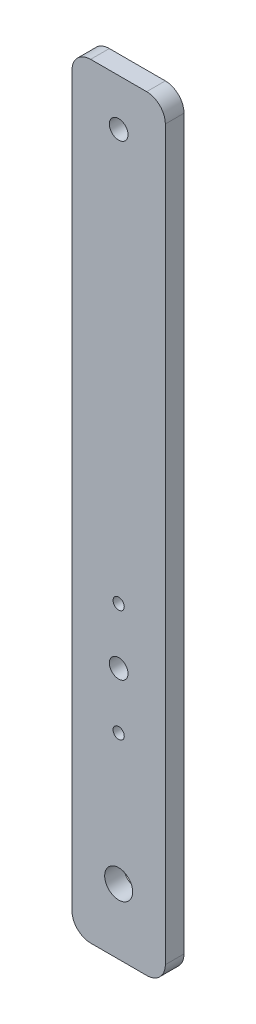
ISO-10303-21;
HEADER;
FILE_DESCRIPTION(('STEP AP214'),'2;1');
FILE_NAME('part.step','',(''),(''),'','','');
FILE_SCHEMA(('AUTOMOTIVE_DESIGN { 1 0 10303 214 1 1 1 1 }'));
ENDSEC;
DATA;
#1=APPLICATION_CONTEXT('core data for automotive mechanical design processes');
#2=APPLICATION_PROTOCOL_DEFINITION('international standard','automotive_design',2000,#1);
#3=PRODUCT_CONTEXT('',#1,'mechanical');
#4=PRODUCT('Part','Part','',(#3));
#5=PRODUCT_RELATED_PRODUCT_CATEGORY('part','',(#4));
#6=PRODUCT_DEFINITION_FORMATION('','',#4);
#7=PRODUCT_DEFINITION_CONTEXT('part definition',#1,'design');
#8=PRODUCT_DEFINITION('design','',#6,#7);
#9=PRODUCT_DEFINITION_SHAPE('','',#8);
#10=(LENGTH_UNIT() NAMED_UNIT(*) SI_UNIT(.MILLI.,.METRE.));
#11=(NAMED_UNIT(*) PLANE_ANGLE_UNIT() SI_UNIT($,.RADIAN.));
#12=(NAMED_UNIT(*) SI_UNIT($,.STERADIAN.) SOLID_ANGLE_UNIT());
#13=UNCERTAINTY_MEASURE_WITH_UNIT(LENGTH_MEASURE(1.E-05),#10,'distance_accuracy_value','');
#14=(GEOMETRIC_REPRESENTATION_CONTEXT(3) GLOBAL_UNCERTAINTY_ASSIGNED_CONTEXT((#13)) GLOBAL_UNIT_ASSIGNED_CONTEXT((#10,
#11,#12)) REPRESENTATION_CONTEXT('',''));
#15=CARTESIAN_POINT('',(0.,0.,0.));
#16=DIRECTION('',(0.,0.,1.));
#17=DIRECTION('',(1.,0.,0.));
#18=AXIS2_PLACEMENT_3D('',#15,#16,#17);
#19=CARTESIAN_POINT('',(0.,0.,10.));
#20=DIRECTION('',(0.,0.,1.));
#21=DIRECTION('',(1.,0.,0.));
#22=AXIS2_PLACEMENT_3D('',#19,#20,#21);
#23=PLANE('',#22);
#24=CARTESIAN_POINT('',(25.,-375.,10.));
#25=DIRECTION('',(0.,0.,1.));
#26=DIRECTION('',(1.,0.,0.));
#27=AXIS2_PLACEMENT_3D('',#24,#25,#26);
#28=CIRCLE('',#27,7.5);
#29=CARTESIAN_POINT('',(32.5,-375.,10.));
#30=VERTEX_POINT('',#29);
#31=EDGE_CURVE('E206',#30,#30,#28,.T.);
#32=ORIENTED_EDGE('',*,*,#31,.F.);
#33=EDGE_LOOP('',(#32));
#34=FACE_BOUND('',#33,.T.);
#35=CARTESIAN_POINT('',(25.,-245.,10.));
#36=DIRECTION('',(0.,0.,1.));
#37=DIRECTION('',(1.,0.,0.));
#38=AXIS2_PLACEMENT_3D('',#35,#36,#37);
#39=CIRCLE('',#38,3.);
#40=CARTESIAN_POINT('',(28.,-245.,10.));
#41=VERTEX_POINT('',#40);
#42=EDGE_CURVE('E191',#41,#41,#39,.T.);
#43=ORIENTED_EDGE('',*,*,#42,.F.);
#44=EDGE_LOOP('',(#43));
#45=FACE_BOUND('',#44,.T.);
#46=CARTESIAN_POINT('',(25.,-275.,10.));
#47=DIRECTION('',(0.,0.,1.));
#48=DIRECTION('',(1.,0.,0.));
#49=AXIS2_PLACEMENT_3D('',#46,#47,#48);
#50=CIRCLE('',#49,5.);
#51=CARTESIAN_POINT('',(30.,-275.,10.));
#52=VERTEX_POINT('',#51);
#53=EDGE_CURVE('E129',#52,#52,#50,.T.);
#54=ORIENTED_EDGE('',*,*,#53,.F.);
#55=EDGE_LOOP('',(#54));
#56=FACE_BOUND('',#55,.T.);
#57=DIRECTION('',(-1.,0.,0.));
#58=VECTOR('',#57,1.);
#59=CARTESIAN_POINT('',(0.,0.,10.));
#60=LINE('',#59,#58);
#61=CARTESIAN_POINT('',(40.,0.,10.));
#62=VERTEX_POINT('',#61);
#63=CARTESIAN_POINT('',(10.,0.,10.));
#64=VERTEX_POINT('',#63);
#65=EDGE_CURVE('E138',#62,#64,#60,.T.);
#66=ORIENTED_EDGE('',*,*,#65,.T.);
#67=CARTESIAN_POINT('',(10.,-10.,10.));
#68=DIRECTION('',(0.,0.,1.));
#69=DIRECTION('',(1.,0.,0.));
#70=AXIS2_PLACEMENT_3D('',#67,#68,#69);
#71=CIRCLE('',#70,10.);
#72=CARTESIAN_POINT('',(0.,-10.,10.));
#73=VERTEX_POINT('',#72);
#74=EDGE_CURVE('E156',#64,#73,#71,.T.);
#75=ORIENTED_EDGE('',*,*,#74,.T.);
#76=DIRECTION('',(0.,-1.,0.));
#77=VECTOR('',#76,1.);
#78=CARTESIAN_POINT('',(0.,0.,10.));
#79=LINE('',#78,#77);
#80=CARTESIAN_POINT('',(0.,-400.,10.));
#81=VERTEX_POINT('',#80);
#82=EDGE_CURVE('E120',#73,#81,#79,.T.);
#83=ORIENTED_EDGE('',*,*,#82,.T.);
#84=CARTESIAN_POINT('',(10.,-400.,10.));
#85=DIRECTION('',(0.,0.,1.));
#86=DIRECTION('',(1.,0.,0.));
#87=AXIS2_PLACEMENT_3D('',#84,#85,#86);
#88=CIRCLE('',#87,10.);
#89=CARTESIAN_POINT('',(10.,-410.,10.));
#90=VERTEX_POINT('',#89);
#91=EDGE_CURVE('E152',#81,#90,#88,.T.);
#92=ORIENTED_EDGE('',*,*,#91,.T.);
#93=DIRECTION('',(1.,0.,0.));
#94=VECTOR('',#93,1.);
#95=CARTESIAN_POINT('',(0.,-410.,10.));
#96=LINE('',#95,#94);
#97=CARTESIAN_POINT('',(40.,-410.,10.));
#98=VERTEX_POINT('',#97);
#99=EDGE_CURVE('E165',#90,#98,#96,.T.);
#100=ORIENTED_EDGE('',*,*,#99,.T.);
#101=CARTESIAN_POINT('',(40.,-400.,10.));
#102=DIRECTION('',(0.,0.,1.));
#103=DIRECTION('',(1.,0.,0.));
#104=AXIS2_PLACEMENT_3D('',#101,#102,#103);
#105=CIRCLE('',#104,10.);
#106=CARTESIAN_POINT('',(50.,-400.,10.));
#107=VERTEX_POINT('',#106);
#108=EDGE_CURVE('E55',#98,#107,#105,.T.);
#109=ORIENTED_EDGE('',*,*,#108,.T.);
#110=DIRECTION('',(0.,1.,0.));
#111=VECTOR('',#110,1.);
#112=CARTESIAN_POINT('',(50.,0.,10.));
#113=LINE('',#112,#111);
#114=CARTESIAN_POINT('',(50.,-9.99999999999999,10.));
#115=VERTEX_POINT('',#114);
#116=EDGE_CURVE('E171',#107,#115,#113,.T.);
#117=ORIENTED_EDGE('',*,*,#116,.T.);
#118=CARTESIAN_POINT('',(40.,-10.,10.));
#119=DIRECTION('',(0.,0.,1.));
#120=DIRECTION('',(1.,0.,0.));
#121=AXIS2_PLACEMENT_3D('',#118,#119,#120);
#122=CIRCLE('',#121,10.);
#123=EDGE_CURVE('E154',#115,#62,#122,.T.);
#124=ORIENTED_EDGE('',*,*,#123,.T.);
#125=EDGE_LOOP('',(#66,#75,#83,#92,#100,#109,#117,#124));
#126=FACE_BOUND('',#125,.T.);
#127=CARTESIAN_POINT('',(25.,-25.,10.));
#128=DIRECTION('',(0.,0.,1.));
#129=DIRECTION('',(1.,0.,0.));
#130=AXIS2_PLACEMENT_3D('',#127,#128,#129);
#131=CIRCLE('',#130,5.);
#132=CARTESIAN_POINT('',(30.,-25.,10.));
#133=VERTEX_POINT('',#132);
#134=EDGE_CURVE('E186',#133,#133,#131,.T.);
#135=ORIENTED_EDGE('',*,*,#134,.F.);
#136=EDGE_LOOP('',(#135));
#137=FACE_BOUND('',#136,.T.);
#138=CARTESIAN_POINT('',(25.,-305.,10.));
#139=DIRECTION('',(0.,0.,1.));
#140=DIRECTION('',(1.,0.,0.));
#141=AXIS2_PLACEMENT_3D('',#138,#139,#140);
#142=CIRCLE('',#141,3.);
#143=CARTESIAN_POINT('',(28.,-305.,10.));
#144=VERTEX_POINT('',#143);
#145=EDGE_CURVE('E197',#144,#144,#142,.T.);
#146=ORIENTED_EDGE('',*,*,#145,.F.);
#147=EDGE_LOOP('',(#146));
#148=FACE_BOUND('',#147,.T.);
#149=ADVANCED_FACE('F33',(#34,#45,#56,#126,#137,#148),#23,.T.);
#150=CARTESIAN_POINT('',(0.,0.,0.));
#151=DIRECTION('',(0.,0.,1.));
#152=DIRECTION('',(1.,0.,0.));
#153=AXIS2_PLACEMENT_3D('',#150,#151,#152);
#154=PLANE('',#153);
#155=CARTESIAN_POINT('',(25.,-375.,0.));
#156=DIRECTION('',(0.,0.,1.));
#157=DIRECTION('',(1.,0.,0.));
#158=AXIS2_PLACEMENT_3D('',#155,#156,#157);
#159=CIRCLE('',#158,7.5);
#160=CARTESIAN_POINT('',(32.5,-375.,0.));
#161=VERTEX_POINT('',#160);
#162=EDGE_CURVE('E203',#161,#161,#159,.T.);
#163=ORIENTED_EDGE('',*,*,#162,.T.);
#164=EDGE_LOOP('',(#163));
#165=FACE_BOUND('',#164,.T.);
#166=DIRECTION('',(0.,-1.,0.));
#167=VECTOR('',#166,1.);
#168=CARTESIAN_POINT('',(0.,0.,0.));
#169=LINE('',#168,#167);
#170=CARTESIAN_POINT('',(0.,-10.,0.));
#171=VERTEX_POINT('',#170);
#172=CARTESIAN_POINT('',(0.,-400.,0.));
#173=VERTEX_POINT('',#172);
#174=EDGE_CURVE('E117',#171,#173,#169,.T.);
#175=ORIENTED_EDGE('',*,*,#174,.F.);
#176=CARTESIAN_POINT('',(10.,-10.,0.));
#177=DIRECTION('',(0.,0.,1.));
#178=DIRECTION('',(1.,0.,0.));
#179=AXIS2_PLACEMENT_3D('',#176,#177,#178);
#180=CIRCLE('',#179,10.);
#181=CARTESIAN_POINT('',(10.,0.,0.));
#182=VERTEX_POINT('',#181);
#183=EDGE_CURVE('E100',#171,#182,#180,.F.);
#184=ORIENTED_EDGE('',*,*,#183,.T.);
#185=DIRECTION('',(-1.,0.,0.));
#186=VECTOR('',#185,1.);
#187=CARTESIAN_POINT('',(0.,0.,0.));
#188=LINE('',#187,#186);
#189=CARTESIAN_POINT('',(40.,0.,0.));
#190=VERTEX_POINT('',#189);
#191=EDGE_CURVE('E142',#190,#182,#188,.T.);
#192=ORIENTED_EDGE('',*,*,#191,.F.);
#193=CARTESIAN_POINT('',(40.,-10.,0.));
#194=DIRECTION('',(0.,0.,1.));
#195=DIRECTION('',(1.,0.,0.));
#196=AXIS2_PLACEMENT_3D('',#193,#194,#195);
#197=CIRCLE('',#196,10.);
#198=CARTESIAN_POINT('',(50.,-9.99999999999999,0.));
#199=VERTEX_POINT('',#198);
#200=EDGE_CURVE('E111',#190,#199,#197,.F.);
#201=ORIENTED_EDGE('',*,*,#200,.T.);
#202=DIRECTION('',(0.,1.,0.));
#203=VECTOR('',#202,1.);
#204=CARTESIAN_POINT('',(50.,0.,0.));
#205=LINE('',#204,#203);
#206=CARTESIAN_POINT('',(50.,-400.,0.));
#207=VERTEX_POINT('',#206);
#208=EDGE_CURVE('E132',#207,#199,#205,.T.);
#209=ORIENTED_EDGE('',*,*,#208,.F.);
#210=CARTESIAN_POINT('',(40.,-400.,0.));
#211=DIRECTION('',(0.,0.,1.));
#212=DIRECTION('',(1.,0.,0.));
#213=AXIS2_PLACEMENT_3D('',#210,#211,#212);
#214=CIRCLE('',#213,10.);
#215=CARTESIAN_POINT('',(40.,-410.,0.));
#216=VERTEX_POINT('',#215);
#217=EDGE_CURVE('E121',#207,#216,#214,.F.);
#218=ORIENTED_EDGE('',*,*,#217,.T.);
#219=DIRECTION('',(1.,0.,0.));
#220=VECTOR('',#219,1.);
#221=CARTESIAN_POINT('',(0.,-410.,0.));
#222=LINE('',#221,#220);
#223=CARTESIAN_POINT('',(10.,-410.,0.));
#224=VERTEX_POINT('',#223);
#225=EDGE_CURVE('E128',#224,#216,#222,.T.);
#226=ORIENTED_EDGE('',*,*,#225,.F.);
#227=CARTESIAN_POINT('',(10.,-400.,0.));
#228=DIRECTION('',(0.,0.,1.));
#229=DIRECTION('',(1.,0.,0.));
#230=AXIS2_PLACEMENT_3D('',#227,#228,#229);
#231=CIRCLE('',#230,10.);
#232=EDGE_CURVE('E127',#224,#173,#231,.F.);
#233=ORIENTED_EDGE('',*,*,#232,.T.);
#234=EDGE_LOOP('',(#175,#184,#192,#201,#209,#218,#226,#233));
#235=FACE_BOUND('',#234,.T.);
#236=CARTESIAN_POINT('',(25.,-275.,0.));
#237=DIRECTION('',(0.,0.,1.));
#238=DIRECTION('',(1.,0.,0.));
#239=AXIS2_PLACEMENT_3D('',#236,#237,#238);
#240=CIRCLE('',#239,5.);
#241=CARTESIAN_POINT('',(30.,-275.,0.));
#242=VERTEX_POINT('',#241);
#243=EDGE_CURVE('E135',#242,#242,#240,.T.);
#244=ORIENTED_EDGE('',*,*,#243,.T.);
#245=EDGE_LOOP('',(#244));
#246=FACE_BOUND('',#245,.T.);
#247=CARTESIAN_POINT('',(25.,-25.,0.));
#248=DIRECTION('',(0.,0.,1.));
#249=DIRECTION('',(1.,0.,0.));
#250=AXIS2_PLACEMENT_3D('',#247,#248,#249);
#251=CIRCLE('',#250,5.);
#252=CARTESIAN_POINT('',(30.,-25.,0.));
#253=VERTEX_POINT('',#252);
#254=EDGE_CURVE('E188',#253,#253,#251,.T.);
#255=ORIENTED_EDGE('',*,*,#254,.T.);
#256=EDGE_LOOP('',(#255));
#257=FACE_BOUND('',#256,.T.);
#258=CARTESIAN_POINT('',(25.,-245.,0.));
#259=DIRECTION('',(0.,0.,1.));
#260=DIRECTION('',(1.,0.,0.));
#261=AXIS2_PLACEMENT_3D('',#258,#259,#260);
#262=CIRCLE('',#261,3.);
#263=CARTESIAN_POINT('',(28.,-245.,0.));
#264=VERTEX_POINT('',#263);
#265=EDGE_CURVE('E194',#264,#264,#262,.T.);
#266=ORIENTED_EDGE('',*,*,#265,.T.);
#267=EDGE_LOOP('',(#266));
#268=FACE_BOUND('',#267,.T.);
#269=CARTESIAN_POINT('',(25.,-305.,0.));
#270=DIRECTION('',(0.,0.,1.));
#271=DIRECTION('',(1.,0.,0.));
#272=AXIS2_PLACEMENT_3D('',#269,#270,#271);
#273=CIRCLE('',#272,3.);
#274=CARTESIAN_POINT('',(28.,-305.,0.));
#275=VERTEX_POINT('',#274);
#276=EDGE_CURVE('E200',#275,#275,#273,.T.);
#277=ORIENTED_EDGE('',*,*,#276,.T.);
#278=EDGE_LOOP('',(#277));
#279=FACE_BOUND('',#278,.T.);
#280=ADVANCED_FACE('F124',(#165,#235,#246,#257,#268,#279),#154,.F.);
#281=CARTESIAN_POINT('',(0.,0.,10.));
#282=DIRECTION('',(1.,0.,0.));
#283=DIRECTION('',(0.,1.,0.));
#284=AXIS2_PLACEMENT_3D('',#281,#282,#283);
#285=PLANE('',#284);
#286=ORIENTED_EDGE('',*,*,#82,.F.);
#287=DIRECTION('',(0.,0.,-1.));
#288=VECTOR('',#287,1.);
#289=CARTESIAN_POINT('',(0.,-10.,10.));
#290=LINE('',#289,#288);
#291=EDGE_CURVE('E104',#73,#171,#290,.T.);
#292=ORIENTED_EDGE('',*,*,#291,.T.);
#293=ORIENTED_EDGE('',*,*,#174,.T.);
#294=DIRECTION('',(0.,0.,-1.));
#295=VECTOR('',#294,1.);
#296=CARTESIAN_POINT('',(0.,-400.,10.));
#297=LINE('',#296,#295);
#298=EDGE_CURVE('E122',#173,#81,#297,.F.);
#299=ORIENTED_EDGE('',*,*,#298,.T.);
#300=EDGE_LOOP('',(#286,#292,#293,#299));
#301=FACE_BOUND('',#300,.T.);
#302=ADVANCED_FACE('F116',(#301),#285,.F.);
#303=CARTESIAN_POINT('',(0.,-410.,10.));
#304=DIRECTION('',(0.,1.,0.));
#305=DIRECTION('',(0.,0.,1.));
#306=AXIS2_PLACEMENT_3D('',#303,#304,#305);
#307=PLANE('',#306);
#308=ORIENTED_EDGE('',*,*,#99,.F.);
#309=DIRECTION('',(0.,0.,-1.));
#310=VECTOR('',#309,1.);
#311=CARTESIAN_POINT('',(10.,-410.,10.));
#312=LINE('',#311,#310);
#313=EDGE_CURVE('E11',#90,#224,#312,.T.);
#314=ORIENTED_EDGE('',*,*,#313,.T.);
#315=ORIENTED_EDGE('',*,*,#225,.T.);
#316=DIRECTION('',(0.,0.,-1.));
#317=VECTOR('',#316,1.);
#318=CARTESIAN_POINT('',(40.,-410.,10.));
#319=LINE('',#318,#317);
#320=EDGE_CURVE('E41',#216,#98,#319,.F.);
#321=ORIENTED_EDGE('',*,*,#320,.T.);
#322=EDGE_LOOP('',(#308,#314,#315,#321));
#323=FACE_BOUND('',#322,.T.);
#324=ADVANCED_FACE('F164',(#323),#307,.F.);
#325=CARTESIAN_POINT('',(50.,0.,10.));
#326=DIRECTION('',(-1.,0.,0.));
#327=DIRECTION('',(0.,-1.,0.));
#328=AXIS2_PLACEMENT_3D('',#325,#326,#327);
#329=PLANE('',#328);
#330=ORIENTED_EDGE('',*,*,#208,.T.);
#331=DIRECTION('',(0.,0.,-1.));
#332=VECTOR('',#331,1.);
#333=CARTESIAN_POINT('',(50.,-10.,10.));
#334=LINE('',#333,#332);
#335=EDGE_CURVE('E48',#199,#115,#334,.F.);
#336=ORIENTED_EDGE('',*,*,#335,.T.);
#337=ORIENTED_EDGE('',*,*,#116,.F.);
#338=DIRECTION('',(0.,0.,-1.));
#339=VECTOR('',#338,1.);
#340=CARTESIAN_POINT('',(50.,-400.,10.));
#341=LINE('',#340,#339);
#342=EDGE_CURVE('E158',#107,#207,#341,.T.);
#343=ORIENTED_EDGE('',*,*,#342,.T.);
#344=EDGE_LOOP('',(#330,#336,#337,#343));
#345=FACE_BOUND('',#344,.T.);
#346=ADVANCED_FACE('F175',(#345),#329,.F.);
#347=CARTESIAN_POINT('',(0.,0.,10.));
#348=DIRECTION('',(0.,-1.,0.));
#349=DIRECTION('',(0.,0.,-1.));
#350=AXIS2_PLACEMENT_3D('',#347,#348,#349);
#351=PLANE('',#350);
#352=ORIENTED_EDGE('',*,*,#191,.T.);
#353=DIRECTION('',(0.,0.,-1.));
#354=VECTOR('',#353,1.);
#355=CARTESIAN_POINT('',(10.,0.,10.));
#356=LINE('',#355,#354);
#357=EDGE_CURVE('E105',#182,#64,#356,.F.);
#358=ORIENTED_EDGE('',*,*,#357,.T.);
#359=ORIENTED_EDGE('',*,*,#65,.F.);
#360=DIRECTION('',(0.,0.,-1.));
#361=VECTOR('',#360,1.);
#362=CARTESIAN_POINT('',(40.,0.,10.));
#363=LINE('',#362,#361);
#364=EDGE_CURVE('E110',#62,#190,#363,.T.);
#365=ORIENTED_EDGE('',*,*,#364,.T.);
#366=EDGE_LOOP('',(#352,#358,#359,#365));
#367=FACE_BOUND('',#366,.T.);
#368=ADVANCED_FACE('F182',(#367),#351,.F.);
#369=CARTESIAN_POINT('',(25.,-275.,10.));
#370=DIRECTION('',(0.,0.,-1.));
#371=DIRECTION('',(-1.,0.,0.));
#372=AXIS2_PLACEMENT_3D('',#369,#370,#371);
#373=CYLINDRICAL_SURFACE('',#372,5.);
#374=ORIENTED_EDGE('',*,*,#53,.T.);
#375=EDGE_LOOP('',(#374));
#376=FACE_BOUND('',#375,.T.);
#377=ORIENTED_EDGE('',*,*,#243,.F.);
#378=EDGE_LOOP('',(#377));
#379=FACE_BOUND('',#378,.T.);
#380=ADVANCED_FACE('F226',(#376,#379),#373,.F.);
#381=CARTESIAN_POINT('',(25.,-25.,10.));
#382=DIRECTION('',(0.,0.,-1.));
#383=DIRECTION('',(-1.,0.,0.));
#384=AXIS2_PLACEMENT_3D('',#381,#382,#383);
#385=CYLINDRICAL_SURFACE('',#384,5.);
#386=ORIENTED_EDGE('',*,*,#134,.T.);
#387=EDGE_LOOP('',(#386));
#388=FACE_BOUND('',#387,.T.);
#389=ORIENTED_EDGE('',*,*,#254,.F.);
#390=EDGE_LOOP('',(#389));
#391=FACE_BOUND('',#390,.T.);
#392=ADVANCED_FACE('F229',(#388,#391),#385,.F.);
#393=CARTESIAN_POINT('',(25.,-245.,10.));
#394=DIRECTION('',(0.,0.,-1.));
#395=DIRECTION('',(-1.,0.,0.));
#396=AXIS2_PLACEMENT_3D('',#393,#394,#395);
#397=CYLINDRICAL_SURFACE('',#396,3.);
#398=ORIENTED_EDGE('',*,*,#42,.T.);
#399=EDGE_LOOP('',(#398));
#400=FACE_BOUND('',#399,.T.);
#401=ORIENTED_EDGE('',*,*,#265,.F.);
#402=EDGE_LOOP('',(#401));
#403=FACE_BOUND('',#402,.T.);
#404=ADVANCED_FACE('F243',(#400,#403),#397,.F.);
#405=CARTESIAN_POINT('',(25.,-305.,10.));
#406=DIRECTION('',(0.,0.,-1.));
#407=DIRECTION('',(-1.,0.,0.));
#408=AXIS2_PLACEMENT_3D('',#405,#406,#407);
#409=CYLINDRICAL_SURFACE('',#408,3.);
#410=ORIENTED_EDGE('',*,*,#145,.T.);
#411=EDGE_LOOP('',(#410));
#412=FACE_BOUND('',#411,.T.);
#413=ORIENTED_EDGE('',*,*,#276,.F.);
#414=EDGE_LOOP('',(#413));
#415=FACE_BOUND('',#414,.T.);
#416=ADVANCED_FACE('F241',(#412,#415),#409,.F.);
#417=CARTESIAN_POINT('',(10.,-10.,10.));
#418=DIRECTION('',(0.,0.,-1.));
#419=DIRECTION('',(-1.,0.,0.));
#420=AXIS2_PLACEMENT_3D('',#417,#418,#419);
#421=CYLINDRICAL_SURFACE('',#420,10.);
#422=ORIENTED_EDGE('',*,*,#74,.F.);
#423=ORIENTED_EDGE('',*,*,#357,.F.);
#424=ORIENTED_EDGE('',*,*,#183,.F.);
#425=ORIENTED_EDGE('',*,*,#291,.F.);
#426=EDGE_LOOP('',(#422,#423,#424,#425));
#427=FACE_BOUND('',#426,.T.);
#428=ADVANCED_FACE('F103',(#427),#421,.T.);
#429=CARTESIAN_POINT('',(40.,-10.,10.));
#430=DIRECTION('',(0.,0.,-1.));
#431=DIRECTION('',(-1.,0.,0.));
#432=AXIS2_PLACEMENT_3D('',#429,#430,#431);
#433=CYLINDRICAL_SURFACE('',#432,10.);
#434=ORIENTED_EDGE('',*,*,#123,.F.);
#435=ORIENTED_EDGE('',*,*,#335,.F.);
#436=ORIENTED_EDGE('',*,*,#200,.F.);
#437=ORIENTED_EDGE('',*,*,#364,.F.);
#438=EDGE_LOOP('',(#434,#435,#436,#437));
#439=FACE_BOUND('',#438,.T.);
#440=ADVANCED_FACE('F179',(#439),#433,.T.);
#441=CARTESIAN_POINT('',(10.,-400.,10.));
#442=DIRECTION('',(0.,0.,-1.));
#443=DIRECTION('',(-1.,0.,0.));
#444=AXIS2_PLACEMENT_3D('',#441,#442,#443);
#445=CYLINDRICAL_SURFACE('',#444,10.);
#446=ORIENTED_EDGE('',*,*,#91,.F.);
#447=ORIENTED_EDGE('',*,*,#298,.F.);
#448=ORIENTED_EDGE('',*,*,#232,.F.);
#449=ORIENTED_EDGE('',*,*,#313,.F.);
#450=EDGE_LOOP('',(#446,#447,#448,#449));
#451=FACE_BOUND('',#450,.T.);
#452=ADVANCED_FACE('F266',(#451),#445,.T.);
#453=CARTESIAN_POINT('',(40.,-400.,10.));
#454=DIRECTION('',(0.,0.,-1.));
#455=DIRECTION('',(-1.,0.,0.));
#456=AXIS2_PLACEMENT_3D('',#453,#454,#455);
#457=CYLINDRICAL_SURFACE('',#456,10.);
#458=ORIENTED_EDGE('',*,*,#108,.F.);
#459=ORIENTED_EDGE('',*,*,#320,.F.);
#460=ORIENTED_EDGE('',*,*,#217,.F.);
#461=ORIENTED_EDGE('',*,*,#342,.F.);
#462=EDGE_LOOP('',(#458,#459,#460,#461));
#463=FACE_BOUND('',#462,.T.);
#464=ADVANCED_FACE('F35',(#463),#457,.T.);
#465=CARTESIAN_POINT('',(25.,-375.,0.));
#466=DIRECTION('',(0.,0.,1.));
#467=DIRECTION('',(1.,0.,0.));
#468=AXIS2_PLACEMENT_3D('',#465,#466,#467);
#469=CYLINDRICAL_SURFACE('',#468,7.5);
#470=ORIENTED_EDGE('',*,*,#162,.F.);
#471=EDGE_LOOP('',(#470));
#472=FACE_BOUND('',#471,.T.);
#473=ORIENTED_EDGE('',*,*,#31,.T.);
#474=EDGE_LOOP('',(#473));
#475=FACE_BOUND('',#474,.T.);
#476=ADVANCED_FACE('F213',(#472,#475),#469,.F.);
#477=CLOSED_SHELL('',(#149,#280,#302,#324,#346,#368,#380,#392,#404,#416,#428,#440,#452,#464,#476));
#478=MANIFOLD_SOLID_BREP('B2',#477);
#479=ADVANCED_BREP_SHAPE_REPRESENTATION('',(#18,#478),#14);
#480=SHAPE_DEFINITION_REPRESENTATION(#9,#479);
ENDSEC;
END-ISO-10303-21;
